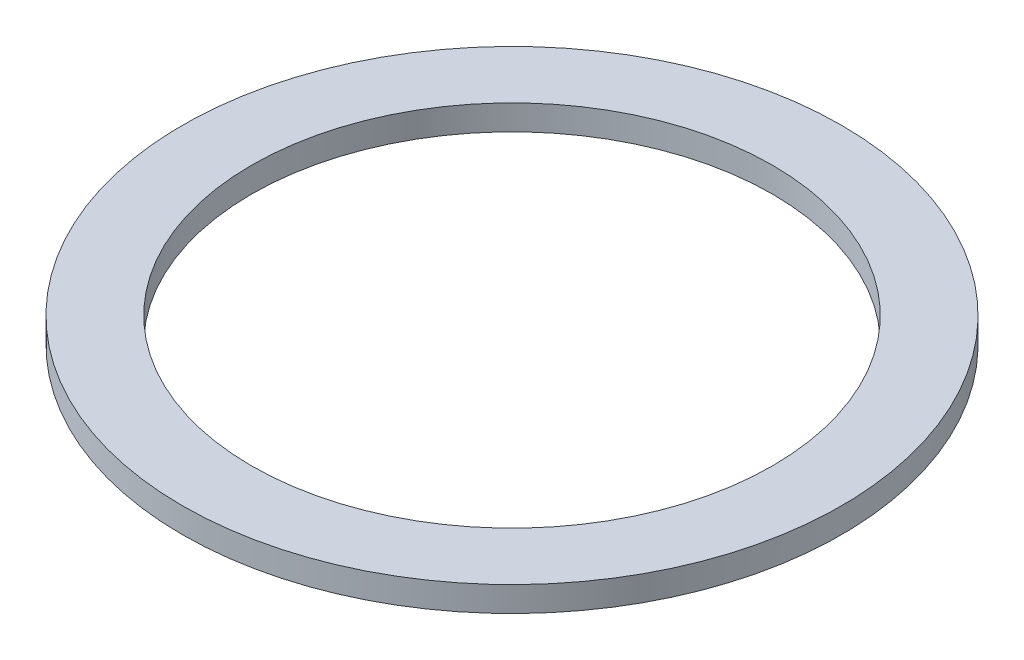
ISO-10303-21;
HEADER;
FILE_DESCRIPTION(('STEP AP214'),'2;1');
FILE_NAME('part.step','',(''),(''),'','','');
FILE_SCHEMA(('AUTOMOTIVE_DESIGN { 1 0 10303 214 1 1 1 1 }'));
ENDSEC;
DATA;
#1=APPLICATION_CONTEXT('core data for automotive mechanical design processes');
#2=APPLICATION_PROTOCOL_DEFINITION('international standard','automotive_design',2000,#1);
#3=PRODUCT_CONTEXT('',#1,'mechanical');
#4=PRODUCT('Part','Part','',(#3));
#5=PRODUCT_RELATED_PRODUCT_CATEGORY('part','',(#4));
#6=PRODUCT_DEFINITION_FORMATION('','',#4);
#7=PRODUCT_DEFINITION_CONTEXT('part definition',#1,'design');
#8=PRODUCT_DEFINITION('design','',#6,#7);
#9=PRODUCT_DEFINITION_SHAPE('','',#8);
#10=(LENGTH_UNIT() NAMED_UNIT(*) SI_UNIT(.MILLI.,.METRE.));
#11=(NAMED_UNIT(*) PLANE_ANGLE_UNIT() SI_UNIT($,.RADIAN.));
#12=(NAMED_UNIT(*) SI_UNIT($,.STERADIAN.) SOLID_ANGLE_UNIT());
#13=UNCERTAINTY_MEASURE_WITH_UNIT(LENGTH_MEASURE(1.E-05),#10,'distance_accuracy_value','');
#14=(GEOMETRIC_REPRESENTATION_CONTEXT(3) GLOBAL_UNCERTAINTY_ASSIGNED_CONTEXT((#13)) GLOBAL_UNIT_ASSIGNED_CONTEXT((#10,
#11,#12)) REPRESENTATION_CONTEXT('',''));
#15=CARTESIAN_POINT('',(0.,0.,0.));
#16=DIRECTION('',(0.,0.,1.));
#17=DIRECTION('',(1.,0.,0.));
#18=AXIS2_PLACEMENT_3D('',#15,#16,#17);
#19=CARTESIAN_POINT('',(0.,1.016,0.));
#20=DIRECTION('',(0.,1.,0.));
#21=DIRECTION('',(0.,0.,1.));
#22=AXIS2_PLACEMENT_3D('',#19,#20,#21);
#23=PLANE('',#22);
#24=CARTESIAN_POINT('',(0.,1.016,0.));
#25=DIRECTION('',(0.,1.,0.));
#26=DIRECTION('',(0.,0.,1.));
#27=AXIS2_PLACEMENT_3D('',#24,#25,#26);
#28=CIRCLE('',#27,13.35);
#29=CARTESIAN_POINT('',(0.,1.016,13.35));
#30=VERTEX_POINT('',#29);
#31=EDGE_CURVE('E10',#30,#30,#28,.T.);
#32=ORIENTED_EDGE('',*,*,#31,.T.);
#33=EDGE_LOOP('',(#32));
#34=FACE_BOUND('',#33,.T.);
#35=CARTESIAN_POINT('',(0.,1.016,0.));
#36=DIRECTION('',(0.,1.,0.));
#37=DIRECTION('',(0.,0.,1.));
#38=AXIS2_PLACEMENT_3D('',#35,#36,#37);
#39=CIRCLE('',#38,10.55);
#40=CARTESIAN_POINT('',(0.,1.016,10.55));
#41=VERTEX_POINT('',#40);
#42=EDGE_CURVE('E50',#41,#41,#39,.T.);
#43=ORIENTED_EDGE('',*,*,#42,.F.);
#44=EDGE_LOOP('',(#43));
#45=FACE_BOUND('',#44,.T.);
#46=ADVANCED_FACE('F37',(#34,#45),#23,.T.);
#47=CARTESIAN_POINT('',(0.,0.,0.));
#48=DIRECTION('',(0.,1.,0.));
#49=DIRECTION('',(0.,0.,1.));
#50=AXIS2_PLACEMENT_3D('',#47,#48,#49);
#51=PLANE('',#50);
#52=CARTESIAN_POINT('',(0.,0.,0.));
#53=DIRECTION('',(0.,1.,0.));
#54=DIRECTION('',(0.,0.,1.));
#55=AXIS2_PLACEMENT_3D('',#52,#53,#54);
#56=CIRCLE('',#55,13.35);
#57=CARTESIAN_POINT('',(0.,0.,13.35));
#58=VERTEX_POINT('',#57);
#59=EDGE_CURVE('E41',#58,#58,#56,.T.);
#60=ORIENTED_EDGE('',*,*,#59,.F.);
#61=EDGE_LOOP('',(#60));
#62=FACE_BOUND('',#61,.T.);
#63=CARTESIAN_POINT('',(0.,0.,0.));
#64=DIRECTION('',(0.,1.,0.));
#65=DIRECTION('',(0.,0.,1.));
#66=AXIS2_PLACEMENT_3D('',#63,#64,#65);
#67=CIRCLE('',#66,10.55);
#68=CARTESIAN_POINT('',(0.,0.,10.55));
#69=VERTEX_POINT('',#68);
#70=EDGE_CURVE('E52',#69,#69,#67,.T.);
#71=ORIENTED_EDGE('',*,*,#70,.T.);
#72=EDGE_LOOP('',(#71));
#73=FACE_BOUND('',#72,.T.);
#74=ADVANCED_FACE('F64',(#62,#73),#51,.F.);
#75=CARTESIAN_POINT('',(0.,1.016,0.));
#76=DIRECTION('',(0.,-1.,0.));
#77=DIRECTION('',(0.,0.,-1.));
#78=AXIS2_PLACEMENT_3D('',#75,#76,#77);
#79=CYLINDRICAL_SURFACE('',#78,13.35);
#80=ORIENTED_EDGE('',*,*,#31,.F.);
#81=EDGE_LOOP('',(#80));
#82=FACE_BOUND('',#81,.T.);
#83=ORIENTED_EDGE('',*,*,#59,.T.);
#84=EDGE_LOOP('',(#83));
#85=FACE_BOUND('',#84,.T.);
#86=ADVANCED_FACE('F39',(#82,#85),#79,.T.);
#87=CARTESIAN_POINT('',(0.,1.016,0.));
#88=DIRECTION('',(0.,-1.,0.));
#89=DIRECTION('',(0.,0.,-1.));
#90=AXIS2_PLACEMENT_3D('',#87,#88,#89);
#91=CYLINDRICAL_SURFACE('',#90,10.55);
#92=ORIENTED_EDGE('',*,*,#42,.T.);
#93=EDGE_LOOP('',(#92));
#94=FACE_BOUND('',#93,.T.);
#95=ORIENTED_EDGE('',*,*,#70,.F.);
#96=EDGE_LOOP('',(#95));
#97=FACE_BOUND('',#96,.T.);
#98=ADVANCED_FACE('F60',(#94,#97),#91,.F.);
#99=CLOSED_SHELL('',(#46,#74,#86,#98));
#100=MANIFOLD_SOLID_BREP('B2',#99);
#101=ADVANCED_BREP_SHAPE_REPRESENTATION('',(#18,#100),#14);
#102=SHAPE_DEFINITION_REPRESENTATION(#9,#101);
ENDSEC;
END-ISO-10303-21;
